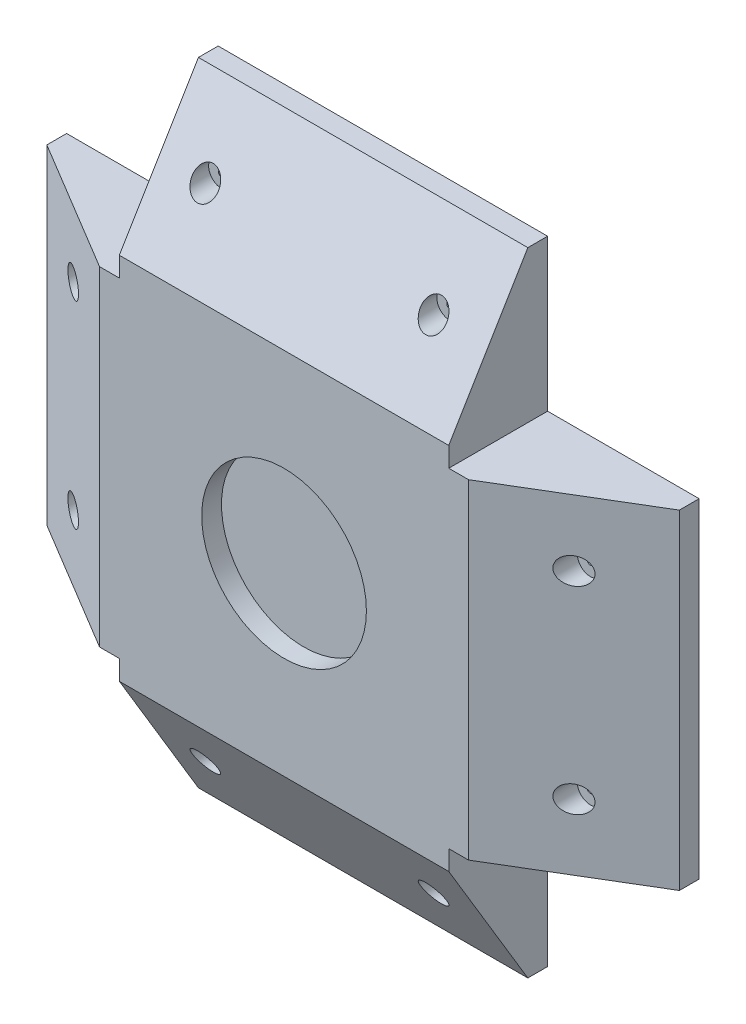
ISO-10303-21;
HEADER;
FILE_DESCRIPTION(('STEP AP214'),'2;1');
FILE_NAME('part.step','',(''),(''),'','','');
FILE_SCHEMA(('AUTOMOTIVE_DESIGN { 1 0 10303 214 1 1 1 1 }'));
ENDSEC;
DATA;
#1=APPLICATION_CONTEXT('core data for automotive mechanical design processes');
#2=APPLICATION_PROTOCOL_DEFINITION('international standard','automotive_design',2000,#1);
#3=PRODUCT_CONTEXT('',#1,'mechanical');
#4=PRODUCT('Part','Part','',(#3));
#5=PRODUCT_RELATED_PRODUCT_CATEGORY('part','',(#4));
#6=PRODUCT_DEFINITION_FORMATION('','',#4);
#7=PRODUCT_DEFINITION_CONTEXT('part definition',#1,'design');
#8=PRODUCT_DEFINITION('design','',#6,#7);
#9=PRODUCT_DEFINITION_SHAPE('','',#8);
#10=(LENGTH_UNIT() NAMED_UNIT(*) SI_UNIT(.MILLI.,.METRE.));
#11=(NAMED_UNIT(*) PLANE_ANGLE_UNIT() SI_UNIT($,.RADIAN.));
#12=(NAMED_UNIT(*) SI_UNIT($,.STERADIAN.) SOLID_ANGLE_UNIT());
#13=UNCERTAINTY_MEASURE_WITH_UNIT(LENGTH_MEASURE(1.E-05),#10,'distance_accuracy_value','');
#14=(GEOMETRIC_REPRESENTATION_CONTEXT(3) GLOBAL_UNCERTAINTY_ASSIGNED_CONTEXT((#13)) GLOBAL_UNIT_ASSIGNED_CONTEXT((#10,
#11,#12)) REPRESENTATION_CONTEXT('',''));
#15=CARTESIAN_POINT('',(0.,0.,0.));
#16=DIRECTION('',(0.,0.,1.));
#17=DIRECTION('',(1.,0.,0.));
#18=AXIS2_PLACEMENT_3D('',#15,#16,#17);
#19=CARTESIAN_POINT('',(-35.8922062958058,-76.,-94.));
#20=DIRECTION('',(0.,0.,1.));
#21=DIRECTION('',(1.,0.,0.));
#22=AXIS2_PLACEMENT_3D('',#19,#20,#21);
#23=CYLINDRICAL_SURFACE('',#22,0.999999999999998);
#24=CARTESIAN_POINT('',(-35.8922062958058,-76.,-24.));
#25=DIRECTION('',(0.,0.,1.));
#26=DIRECTION('',(0.,-1.,0.));
#27=AXIS2_PLACEMENT_3D('',#24,#25,#26);
#28=CIRCLE('',#27,0.999999999999998);
#29=CARTESIAN_POINT('',(-35.8922062958058,-77.,-24.));
#30=VERTEX_POINT('',#29);
#31=EDGE_CURVE('E373',#30,#30,#28,.T.);
#32=ORIENTED_EDGE('',*,*,#31,.F.);
#33=EDGE_LOOP('',(#32));
#34=FACE_BOUND('',#33,.T.);
#35=CARTESIAN_POINT('',(-35.8922062958058,-76.,-11.));
#36=DIRECTION('',(0.,0.,1.));
#37=DIRECTION('',(1.,0.,0.));
#38=AXIS2_PLACEMENT_3D('',#35,#36,#37);
#39=CIRCLE('',#38,0.999999999999998);
#40=CARTESIAN_POINT('',(-34.8922062958058,-76.,-11.));
#41=VERTEX_POINT('',#40);
#42=EDGE_CURVE('E330',#41,#41,#39,.F.);
#43=ORIENTED_EDGE('',*,*,#42,.F.);
#44=EDGE_LOOP('',(#43));
#45=FACE_BOUND('',#44,.T.);
#46=ADVANCED_FACE('F33',(#34,#45),#23,.F.);
#47=CARTESIAN_POINT('',(33.3878088275945,-76.,-94.));
#48=DIRECTION('',(0.,0.,1.));
#49=DIRECTION('',(1.,0.,0.));
#50=AXIS2_PLACEMENT_3D('',#47,#48,#49);
#51=CYLINDRICAL_SURFACE('',#50,0.999999999999998);
#52=CARTESIAN_POINT('',(33.3878088275945,-76.,-24.));
#53=DIRECTION('',(0.,0.,1.));
#54=DIRECTION('',(0.,-1.,0.));
#55=AXIS2_PLACEMENT_3D('',#52,#53,#54);
#56=CIRCLE('',#55,0.999999999999998);
#57=CARTESIAN_POINT('',(33.3878088275945,-77.,-24.));
#58=VERTEX_POINT('',#57);
#59=EDGE_CURVE('E370',#58,#58,#56,.T.);
#60=ORIENTED_EDGE('',*,*,#59,.F.);
#61=EDGE_LOOP('',(#60));
#62=FACE_BOUND('',#61,.T.);
#63=CARTESIAN_POINT('',(33.3878088275945,-76.,-11.));
#64=DIRECTION('',(0.,0.,1.));
#65=DIRECTION('',(1.,0.,0.));
#66=AXIS2_PLACEMENT_3D('',#63,#64,#65);
#67=CIRCLE('',#66,0.999999999999998);
#68=CARTESIAN_POINT('',(34.3878088275945,-76.,-11.));
#69=VERTEX_POINT('',#68);
#70=EDGE_CURVE('E322',#69,#69,#67,.F.);
#71=ORIENTED_EDGE('',*,*,#70,.F.);
#72=EDGE_LOOP('',(#71));
#73=FACE_BOUND('',#72,.T.);
#74=ADVANCED_FACE('F454',(#62,#73),#51,.F.);
#75=CARTESIAN_POINT('',(-50.,50.,6.));
#76=DIRECTION('',(0.,-1.,0.));
#77=DIRECTION('',(0.,0.,-1.));
#78=AXIS2_PLACEMENT_3D('',#75,#76,#77);
#79=PLANE('',#78);
#80=DIRECTION('',(0.,0.,1.));
#81=VECTOR('',#80,1.);
#82=CARTESIAN_POINT('',(50.,50.,6.));
#83=LINE('',#82,#81);
#84=CARTESIAN_POINT('',(50.,50.,-24.));
#85=VERTEX_POINT('',#84);
#86=CARTESIAN_POINT('',(50.,50.,6.));
#87=VERTEX_POINT('',#86);
#88=EDGE_CURVE('E277',#85,#87,#83,.T.);
#89=ORIENTED_EDGE('',*,*,#88,.T.);
#90=DIRECTION('',(-1.,0.,0.));
#91=VECTOR('',#90,1.);
#92=CARTESIAN_POINT('',(-50.,50.,6.));
#93=LINE('',#92,#91);
#94=CARTESIAN_POINT('',(56.,50.,6.));
#95=VERTEX_POINT('',#94);
#96=EDGE_CURVE('E11',#95,#87,#93,.T.);
#97=ORIENTED_EDGE('',*,*,#96,.F.);
#98=DIRECTION('',(-0.857492925712544,0.,0.514495755427527));
#99=VECTOR('',#98,1.);
#100=CARTESIAN_POINT('',(56.,50.,6.));
#101=LINE('',#100,#99);
#102=CARTESIAN_POINT('',(96.,50.,-18.));
#103=VERTEX_POINT('',#102);
#104=EDGE_CURVE('E242',#103,#95,#101,.T.);
#105=ORIENTED_EDGE('',*,*,#104,.F.);
#106=DIRECTION('',(0.,0.,1.));
#107=VECTOR('',#106,1.);
#108=CARTESIAN_POINT('',(96.,50.,-24.));
#109=LINE('',#108,#107);
#110=CARTESIAN_POINT('',(96.,50.,-24.));
#111=VERTEX_POINT('',#110);
#112=EDGE_CURVE('E263',#111,#103,#109,.T.);
#113=ORIENTED_EDGE('',*,*,#112,.F.);
#114=DIRECTION('',(-1.,0.,0.));
#115=VECTOR('',#114,1.);
#116=CARTESIAN_POINT('',(56.,50.,-24.));
#117=LINE('',#116,#115);
#118=EDGE_CURVE('E50',#111,#85,#117,.T.);
#119=ORIENTED_EDGE('',*,*,#118,.T.);
#120=EDGE_LOOP('',(#89,#97,#105,#113,#119));
#121=FACE_BOUND('',#120,.T.);
#122=ADVANCED_FACE('F431',(#121),#79,.F.);
#123=CARTESIAN_POINT('',(-50.,-50.,6.));
#124=DIRECTION('',(0.,1.,0.));
#125=DIRECTION('',(0.,0.,1.));
#126=AXIS2_PLACEMENT_3D('',#123,#124,#125);
#127=PLANE('',#126);
#128=DIRECTION('',(0.,0.,1.));
#129=VECTOR('',#128,1.);
#130=CARTESIAN_POINT('',(-50.,-50.,6.));
#131=LINE('',#130,#129);
#132=CARTESIAN_POINT('',(-50.,-50.,-24.));
#133=VERTEX_POINT('',#132);
#134=CARTESIAN_POINT('',(-50.,-50.,6.));
#135=VERTEX_POINT('',#134);
#136=EDGE_CURVE('E290',#133,#135,#131,.T.);
#137=ORIENTED_EDGE('',*,*,#136,.T.);
#138=DIRECTION('',(1.,0.,0.));
#139=VECTOR('',#138,1.);
#140=CARTESIAN_POINT('',(-50.,-50.,6.));
#141=LINE('',#140,#139);
#142=CARTESIAN_POINT('',(-56.,-50.,6.));
#143=VERTEX_POINT('',#142);
#144=EDGE_CURVE('E302',#143,#135,#141,.T.);
#145=ORIENTED_EDGE('',*,*,#144,.F.);
#146=DIRECTION('',(0.857492925712544,0.,0.514495755427526));
#147=VECTOR('',#146,1.);
#148=CARTESIAN_POINT('',(-96.,-50.,-18.));
#149=LINE('',#148,#147);
#150=CARTESIAN_POINT('',(-96.,-50.,-18.));
#151=VERTEX_POINT('',#150);
#152=EDGE_CURVE('E247',#151,#143,#149,.T.);
#153=ORIENTED_EDGE('',*,*,#152,.F.);
#154=DIRECTION('',(0.,0.,1.));
#155=VECTOR('',#154,1.);
#156=CARTESIAN_POINT('',(-96.,-50.,-24.));
#157=LINE('',#156,#155);
#158=CARTESIAN_POINT('',(-96.,-50.,-24.));
#159=VERTEX_POINT('',#158);
#160=EDGE_CURVE('E257',#159,#151,#157,.T.);
#161=ORIENTED_EDGE('',*,*,#160,.F.);
#162=DIRECTION('',(1.,0.,0.));
#163=VECTOR('',#162,1.);
#164=CARTESIAN_POINT('',(-56.,-50.,-24.));
#165=LINE('',#164,#163);
#166=EDGE_CURVE('E289',#159,#133,#165,.T.);
#167=ORIENTED_EDGE('',*,*,#166,.T.);
#168=EDGE_LOOP('',(#137,#145,#153,#161,#167));
#169=FACE_BOUND('',#168,.T.);
#170=ADVANCED_FACE('F408',(#169),#127,.F.);
#171=CARTESIAN_POINT('',(76.,-30.,36.));
#172=DIRECTION('',(0.,0.,-1.));
#173=DIRECTION('',(-1.,0.,0.));
#174=AXIS2_PLACEMENT_3D('',#171,#172,#173);
#175=CYLINDRICAL_SURFACE('',#174,0.999999999999998);
#176=CARTESIAN_POINT('',(76.,-30.,-24.));
#177=DIRECTION('',(0.,0.,-1.));
#178=DIRECTION('',(-1.,0.,0.));
#179=AXIS2_PLACEMENT_3D('',#176,#177,#178);
#180=CIRCLE('',#179,0.999999999999998);
#181=CARTESIAN_POINT('',(75.,-30.,-24.));
#182=VERTEX_POINT('',#181);
#183=EDGE_CURVE('E235',#182,#182,#180,.T.);
#184=ORIENTED_EDGE('',*,*,#183,.T.);
#185=EDGE_LOOP('',(#184));
#186=FACE_BOUND('',#185,.T.);
#187=CARTESIAN_POINT('',(76.,-30.,-11.));
#188=DIRECTION('',(0.,0.,1.));
#189=DIRECTION('',(1.,0.,0.));
#190=AXIS2_PLACEMENT_3D('',#187,#188,#189);
#191=CIRCLE('',#190,0.999999999999998);
#192=CARTESIAN_POINT('',(77.,-30.,-11.));
#193=VERTEX_POINT('',#192);
#194=EDGE_CURVE('E221',#193,#193,#191,.F.);
#195=ORIENTED_EDGE('',*,*,#194,.F.);
#196=EDGE_LOOP('',(#195));
#197=FACE_BOUND('',#196,.T.);
#198=ADVANCED_FACE('F520',(#186,#197),#175,.F.);
#199=CARTESIAN_POINT('',(76.,30.,36.));
#200=DIRECTION('',(0.,0.,-1.));
#201=DIRECTION('',(-1.,0.,0.));
#202=AXIS2_PLACEMENT_3D('',#199,#200,#201);
#203=CYLINDRICAL_SURFACE('',#202,0.999999999999998);
#204=CARTESIAN_POINT('',(76.,30.,-24.));
#205=DIRECTION('',(0.,0.,-1.));
#206=DIRECTION('',(-1.,0.,0.));
#207=AXIS2_PLACEMENT_3D('',#204,#205,#206);
#208=CIRCLE('',#207,0.999999999999998);
#209=CARTESIAN_POINT('',(75.,30.,-24.));
#210=VERTEX_POINT('',#209);
#211=EDGE_CURVE('E238',#210,#210,#208,.T.);
#212=ORIENTED_EDGE('',*,*,#211,.T.);
#213=EDGE_LOOP('',(#212));
#214=FACE_BOUND('',#213,.T.);
#215=CARTESIAN_POINT('',(76.,30.,-11.));
#216=DIRECTION('',(0.,0.,1.));
#217=DIRECTION('',(1.,0.,0.));
#218=AXIS2_PLACEMENT_3D('',#215,#216,#217);
#219=CIRCLE('',#218,0.999999999999998);
#220=CARTESIAN_POINT('',(77.,30.,-11.));
#221=VERTEX_POINT('',#220);
#222=EDGE_CURVE('E226',#221,#221,#219,.F.);
#223=ORIENTED_EDGE('',*,*,#222,.F.);
#224=EDGE_LOOP('',(#223));
#225=FACE_BOUND('',#224,.T.);
#226=ADVANCED_FACE('F522',(#214,#225),#203,.F.);
#227=CARTESIAN_POINT('',(50.,-50.,6.));
#228=VERTEX_POINT('',#227);
#229=CARTESIAN_POINT('',(56.,-50.,6.));
#230=VERTEX_POINT('',#229);
#231=EDGE_CURVE('E304',#228,#230,#141,.T.);
#232=ORIENTED_EDGE('',*,*,#231,.F.);
#233=DIRECTION('',(0.,0.,-1.));
#234=VECTOR('',#233,1.);
#235=CARTESIAN_POINT('',(50.,-50.,6.));
#236=LINE('',#235,#234);
#237=CARTESIAN_POINT('',(50.,-50.,-24.));
#238=VERTEX_POINT('',#237);
#239=EDGE_CURVE('E273',#228,#238,#236,.T.);
#240=ORIENTED_EDGE('',*,*,#239,.T.);
#241=DIRECTION('',(-1.,0.,0.));
#242=VECTOR('',#241,1.);
#243=CARTESIAN_POINT('',(56.,-50.,-24.));
#244=LINE('',#243,#242);
#245=CARTESIAN_POINT('',(96.,-50.,-24.));
#246=VERTEX_POINT('',#245);
#247=EDGE_CURVE('E58',#246,#238,#244,.T.);
#248=ORIENTED_EDGE('',*,*,#247,.F.);
#249=DIRECTION('',(0.,0.,-1.));
#250=VECTOR('',#249,1.);
#251=CARTESIAN_POINT('',(96.,-50.,-24.));
#252=LINE('',#251,#250);
#253=CARTESIAN_POINT('',(96.,-50.,-18.));
#254=VERTEX_POINT('',#253);
#255=EDGE_CURVE('E269',#254,#246,#252,.T.);
#256=ORIENTED_EDGE('',*,*,#255,.F.);
#257=DIRECTION('',(-0.857492925712544,0.,0.514495755427527));
#258=VECTOR('',#257,1.);
#259=CARTESIAN_POINT('',(56.,-50.,6.));
#260=LINE('',#259,#258);
#261=EDGE_CURVE('E241',#254,#230,#260,.T.);
#262=ORIENTED_EDGE('',*,*,#261,.T.);
#263=EDGE_LOOP('',(#232,#240,#248,#256,#262));
#264=FACE_BOUND('',#263,.T.);
#265=ADVANCED_FACE('F35',(#264),#127,.F.);
#266=CARTESIAN_POINT('',(-50.,50.,6.));
#267=VERTEX_POINT('',#266);
#268=CARTESIAN_POINT('',(-56.,50.,6.));
#269=VERTEX_POINT('',#268);
#270=EDGE_CURVE('E42',#267,#269,#93,.T.);
#271=ORIENTED_EDGE('',*,*,#270,.F.);
#272=DIRECTION('',(0.,0.,-1.));
#273=VECTOR('',#272,1.);
#274=CARTESIAN_POINT('',(-50.,50.,6.));
#275=LINE('',#274,#273);
#276=CARTESIAN_POINT('',(-50.,50.,-24.));
#277=VERTEX_POINT('',#276);
#278=EDGE_CURVE('E296',#267,#277,#275,.T.);
#279=ORIENTED_EDGE('',*,*,#278,.T.);
#280=DIRECTION('',(1.,0.,0.));
#281=VECTOR('',#280,1.);
#282=CARTESIAN_POINT('',(-56.,50.,-24.));
#283=LINE('',#282,#281);
#284=CARTESIAN_POINT('',(-96.,50.,-24.));
#285=VERTEX_POINT('',#284);
#286=EDGE_CURVE('E300',#285,#277,#283,.T.);
#287=ORIENTED_EDGE('',*,*,#286,.F.);
#288=DIRECTION('',(0.,0.,-1.));
#289=VECTOR('',#288,1.);
#290=CARTESIAN_POINT('',(-96.,50.,-24.));
#291=LINE('',#290,#289);
#292=CARTESIAN_POINT('',(-96.,50.,-18.));
#293=VERTEX_POINT('',#292);
#294=EDGE_CURVE('E249',#293,#285,#291,.T.);
#295=ORIENTED_EDGE('',*,*,#294,.F.);
#296=DIRECTION('',(0.857492925712544,0.,0.514495755427526));
#297=VECTOR('',#296,1.);
#298=CARTESIAN_POINT('',(-96.,50.,-18.));
#299=LINE('',#298,#297);
#300=EDGE_CURVE('E244',#293,#269,#299,.T.);
#301=ORIENTED_EDGE('',*,*,#300,.T.);
#302=EDGE_LOOP('',(#271,#279,#287,#295,#301));
#303=FACE_BOUND('',#302,.T.);
#304=ADVANCED_FACE('F396',(#303),#79,.F.);
#305=CARTESIAN_POINT('',(0.,0.,6.));
#306=DIRECTION('',(0.,0.,-1.));
#307=DIRECTION('',(-1.,0.,0.));
#308=AXIS2_PLACEMENT_3D('',#305,#306,#307);
#309=PLANE('',#308);
#310=CARTESIAN_POINT('',(0.,0.,6.));
#311=DIRECTION('',(0.,0.,1.));
#312=DIRECTION('',(1.,0.,0.));
#313=AXIS2_PLACEMENT_3D('',#310,#311,#312);
#314=CIRCLE('',#313,25.);
#315=CARTESIAN_POINT('',(25.,0.,6.));
#316=VERTEX_POINT('',#315);
#317=EDGE_CURVE('E355',#316,#316,#314,.T.);
#318=ORIENTED_EDGE('',*,*,#317,.F.);
#319=EDGE_LOOP('',(#318));
#320=FACE_BOUND('',#319,.T.);
#321=ORIENTED_EDGE('',*,*,#96,.T.);
#322=DIRECTION('',(0.,1.,0.));
#323=VECTOR('',#322,1.);
#324=CARTESIAN_POINT('',(50.,47.,6.));
#325=LINE('',#324,#323);
#326=CARTESIAN_POINT('',(50.,56.,5.99999999999998));
#327=VERTEX_POINT('',#326);
#328=EDGE_CURVE('E169',#87,#327,#325,.T.);
#329=ORIENTED_EDGE('',*,*,#328,.T.);
#330=DIRECTION('',(1.,0.,0.));
#331=VECTOR('',#330,1.);
#332=CARTESIAN_POINT('',(50.,56.,6.));
#333=LINE('',#332,#331);
#334=CARTESIAN_POINT('',(-50.,56.,6.));
#335=VERTEX_POINT('',#334);
#336=EDGE_CURVE('E151',#335,#327,#333,.T.);
#337=ORIENTED_EDGE('',*,*,#336,.F.);
#338=DIRECTION('',(0.,1.,0.));
#339=VECTOR('',#338,1.);
#340=CARTESIAN_POINT('',(-50.,47.,6.));
#341=LINE('',#340,#339);
#342=EDGE_CURVE('E178',#267,#335,#341,.T.);
#343=ORIENTED_EDGE('',*,*,#342,.F.);
#344=ORIENTED_EDGE('',*,*,#270,.T.);
#345=DIRECTION('',(0.,1.,0.));
#346=VECTOR('',#345,1.);
#347=CARTESIAN_POINT('',(-56.,50.,6.));
#348=LINE('',#347,#346);
#349=EDGE_CURVE('E286',#143,#269,#348,.T.);
#350=ORIENTED_EDGE('',*,*,#349,.F.);
#351=ORIENTED_EDGE('',*,*,#144,.T.);
#352=DIRECTION('',(0.,-1.,0.));
#353=VECTOR('',#352,1.);
#354=CARTESIAN_POINT('',(-50.,-47.,6.));
#355=LINE('',#354,#353);
#356=CARTESIAN_POINT('',(-50.,-56.,6.));
#357=VERTEX_POINT('',#356);
#358=EDGE_CURVE('E200',#135,#357,#355,.T.);
#359=ORIENTED_EDGE('',*,*,#358,.T.);
#360=DIRECTION('',(-1.,0.,0.));
#361=VECTOR('',#360,1.);
#362=CARTESIAN_POINT('',(-50.,-56.,6.));
#363=LINE('',#362,#361);
#364=CARTESIAN_POINT('',(50.,-56.,6.00000000000002));
#365=VERTEX_POINT('',#364);
#366=EDGE_CURVE('E197',#365,#357,#363,.T.);
#367=ORIENTED_EDGE('',*,*,#366,.F.);
#368=DIRECTION('',(0.,-1.,0.));
#369=VECTOR('',#368,1.);
#370=CARTESIAN_POINT('',(50.,-47.,6.));
#371=LINE('',#370,#369);
#372=EDGE_CURVE('E204',#228,#365,#371,.T.);
#373=ORIENTED_EDGE('',*,*,#372,.F.);
#374=ORIENTED_EDGE('',*,*,#231,.T.);
#375=DIRECTION('',(0.,-1.,0.));
#376=VECTOR('',#375,1.);
#377=CARTESIAN_POINT('',(56.,-50.,6.));
#378=LINE('',#377,#376);
#379=EDGE_CURVE('E274',#95,#230,#378,.T.);
#380=ORIENTED_EDGE('',*,*,#379,.F.);
#381=EDGE_LOOP('',(#321,#329,#337,#343,#344,#350,#351,#359,#367,#373,#374,#380));
#382=FACE_BOUND('',#381,.T.);
#383=ADVANCED_FACE('F174',(#320,#382),#309,.F.);
#384=CARTESIAN_POINT('',(-56.,50.,-24.));
#385=DIRECTION('',(0.,0.,1.));
#386=DIRECTION('',(0.,-1.,0.));
#387=AXIS2_PLACEMENT_3D('',#384,#385,#386);
#388=PLANE('',#387);
#389=CARTESIAN_POINT('',(-35.8922062958058,76.,-24.));
#390=DIRECTION('',(0.,0.,1.));
#391=DIRECTION('',(0.,-1.,0.));
#392=AXIS2_PLACEMENT_3D('',#389,#390,#391);
#393=CIRCLE('',#392,0.999999999999998);
#394=CARTESIAN_POINT('',(-35.8922062958058,75.,-24.));
#395=VERTEX_POINT('',#394);
#396=EDGE_CURVE('E329',#395,#395,#393,.T.);
#397=ORIENTED_EDGE('',*,*,#396,.T.);
#398=EDGE_LOOP('',(#397));
#399=FACE_BOUND('',#398,.T.);
#400=CARTESIAN_POINT('',(33.3878088275945,76.,-24.));
#401=DIRECTION('',(0.,0.,1.));
#402=DIRECTION('',(0.,-1.,0.));
#403=AXIS2_PLACEMENT_3D('',#400,#401,#402);
#404=CIRCLE('',#403,0.999999999999998);
#405=CARTESIAN_POINT('',(33.3878088275945,75.,-24.));
#406=VERTEX_POINT('',#405);
#407=EDGE_CURVE('E367',#406,#406,#404,.T.);
#408=ORIENTED_EDGE('',*,*,#407,.T.);
#409=EDGE_LOOP('',(#408));
#410=FACE_BOUND('',#409,.T.);
#411=ORIENTED_EDGE('',*,*,#59,.T.);
#412=EDGE_LOOP('',(#411));
#413=FACE_BOUND('',#412,.T.);
#414=ORIENTED_EDGE('',*,*,#31,.T.);
#415=EDGE_LOOP('',(#414));
#416=FACE_BOUND('',#415,.T.);
#417=CARTESIAN_POINT('',(-76.,30.,-24.));
#418=DIRECTION('',(0.,0.,-1.));
#419=DIRECTION('',(1.,0.,0.));
#420=AXIS2_PLACEMENT_3D('',#417,#418,#419);
#421=CIRCLE('',#420,0.999999999999998);
#422=CARTESIAN_POINT('',(-75.,30.,-24.));
#423=VERTEX_POINT('',#422);
#424=EDGE_CURVE('E228',#423,#423,#421,.T.);
#425=ORIENTED_EDGE('',*,*,#424,.F.);
#426=EDGE_LOOP('',(#425));
#427=FACE_BOUND('',#426,.T.);
#428=CARTESIAN_POINT('',(-76.,-30.,-24.));
#429=DIRECTION('',(0.,0.,-1.));
#430=DIRECTION('',(1.,0.,0.));
#431=AXIS2_PLACEMENT_3D('',#428,#429,#430);
#432=CIRCLE('',#431,0.999999999999998);
#433=CARTESIAN_POINT('',(-75.,-30.,-24.));
#434=VERTEX_POINT('',#433);
#435=EDGE_CURVE('E231',#434,#434,#432,.T.);
#436=ORIENTED_EDGE('',*,*,#435,.F.);
#437=EDGE_LOOP('',(#436));
#438=FACE_BOUND('',#437,.T.);
#439=ORIENTED_EDGE('',*,*,#286,.T.);
#440=DIRECTION('',(0.,1.,0.));
#441=VECTOR('',#440,1.);
#442=CARTESIAN_POINT('',(-50.,47.,-24.));
#443=LINE('',#442,#441);
#444=CARTESIAN_POINT('',(-50.,96.,-24.));
#445=VERTEX_POINT('',#444);
#446=EDGE_CURVE('E183',#277,#445,#443,.T.);
#447=ORIENTED_EDGE('',*,*,#446,.T.);
#448=DIRECTION('',(-1.,0.,0.));
#449=VECTOR('',#448,1.);
#450=CARTESIAN_POINT('',(-50.,96.,-24.));
#451=LINE('',#450,#449);
#452=CARTESIAN_POINT('',(50.,96.,-24.));
#453=VERTEX_POINT('',#452);
#454=EDGE_CURVE('E163',#453,#445,#451,.T.);
#455=ORIENTED_EDGE('',*,*,#454,.F.);
#456=DIRECTION('',(0.,1.,0.));
#457=VECTOR('',#456,1.);
#458=CARTESIAN_POINT('',(50.,47.,-24.));
#459=LINE('',#458,#457);
#460=EDGE_CURVE('E162',#85,#453,#459,.T.);
#461=ORIENTED_EDGE('',*,*,#460,.F.);
#462=ORIENTED_EDGE('',*,*,#118,.F.);
#463=DIRECTION('',(0.,1.,0.));
#464=VECTOR('',#463,1.);
#465=CARTESIAN_POINT('',(96.,50.,-24.));
#466=LINE('',#465,#464);
#467=EDGE_CURVE('E271',#246,#111,#466,.T.);
#468=ORIENTED_EDGE('',*,*,#467,.F.);
#469=ORIENTED_EDGE('',*,*,#247,.T.);
#470=DIRECTION('',(0.,-1.,0.));
#471=VECTOR('',#470,1.);
#472=CARTESIAN_POINT('',(50.,-47.,-24.));
#473=LINE('',#472,#471);
#474=CARTESIAN_POINT('',(50.,-96.,-24.));
#475=VERTEX_POINT('',#474);
#476=EDGE_CURVE('E207',#238,#475,#473,.T.);
#477=ORIENTED_EDGE('',*,*,#476,.T.);
#478=DIRECTION('',(1.,0.,0.));
#479=VECTOR('',#478,1.);
#480=CARTESIAN_POINT('',(-50.,-96.,-24.));
#481=LINE('',#480,#479);
#482=CARTESIAN_POINT('',(-50.,-96.,-24.));
#483=VERTEX_POINT('',#482);
#484=EDGE_CURVE('E181',#483,#475,#481,.T.);
#485=ORIENTED_EDGE('',*,*,#484,.F.);
#486=DIRECTION('',(0.,-1.,0.));
#487=VECTOR('',#486,1.);
#488=CARTESIAN_POINT('',(-50.,-47.,-24.));
#489=LINE('',#488,#487);
#490=EDGE_CURVE('E199',#133,#483,#489,.T.);
#491=ORIENTED_EDGE('',*,*,#490,.F.);
#492=ORIENTED_EDGE('',*,*,#166,.F.);
#493=DIRECTION('',(0.,-1.,0.));
#494=VECTOR('',#493,1.);
#495=CARTESIAN_POINT('',(-96.,50.,-24.));
#496=LINE('',#495,#494);
#497=EDGE_CURVE('E254',#285,#159,#496,.T.);
#498=ORIENTED_EDGE('',*,*,#497,.F.);
#499=EDGE_LOOP('',(#439,#447,#455,#461,#462,#468,#469,#477,#485,#491,#492,#498));
#500=FACE_BOUND('',#499,.T.);
#501=ORIENTED_EDGE('',*,*,#183,.F.);
#502=EDGE_LOOP('',(#501));
#503=FACE_BOUND('',#502,.T.);
#504=ORIENTED_EDGE('',*,*,#211,.F.);
#505=EDGE_LOOP('',(#504));
#506=FACE_BOUND('',#505,.T.);
#507=ADVANCED_FACE('F427',(#399,#410,#413,#416,#427,#438,#500,#503,#506),#388,.F.);
#508=CARTESIAN_POINT('',(96.,0.,0.));
#509=DIRECTION('',(1.,0.,0.));
#510=DIRECTION('',(0.,0.,-1.));
#511=AXIS2_PLACEMENT_3D('',#508,#509,#510);
#512=PLANE('',#511);
#513=ORIENTED_EDGE('',*,*,#112,.T.);
#514=DIRECTION('',(0.,-1.,0.));
#515=VECTOR('',#514,1.);
#516=CARTESIAN_POINT('',(96.,50.,-18.));
#517=LINE('',#516,#515);
#518=EDGE_CURVE('E266',#103,#254,#517,.T.);
#519=ORIENTED_EDGE('',*,*,#518,.T.);
#520=ORIENTED_EDGE('',*,*,#255,.T.);
#521=ORIENTED_EDGE('',*,*,#467,.T.);
#522=EDGE_LOOP('',(#513,#519,#520,#521));
#523=FACE_BOUND('',#522,.T.);
#524=ADVANCED_FACE('F434',(#523),#512,.T.);
#525=CARTESIAN_POINT('',(-96.,0.,0.));
#526=DIRECTION('',(1.,0.,0.));
#527=DIRECTION('',(0.,0.,-1.));
#528=AXIS2_PLACEMENT_3D('',#525,#526,#527);
#529=PLANE('',#528);
#530=ORIENTED_EDGE('',*,*,#294,.T.);
#531=ORIENTED_EDGE('',*,*,#497,.T.);
#532=ORIENTED_EDGE('',*,*,#160,.T.);
#533=DIRECTION('',(0.,1.,0.));
#534=VECTOR('',#533,1.);
#535=CARTESIAN_POINT('',(-96.,50.,-18.));
#536=LINE('',#535,#534);
#537=EDGE_CURVE('E260',#151,#293,#536,.T.);
#538=ORIENTED_EDGE('',*,*,#537,.T.);
#539=EDGE_LOOP('',(#530,#531,#532,#538));
#540=FACE_BOUND('',#539,.T.);
#541=ADVANCED_FACE('F403',(#540),#529,.F.);
#542=CARTESIAN_POINT('',(-96.,-50.,-18.));
#543=DIRECTION('',(-0.514495755427526,0.,0.857492925712544));
#544=DIRECTION('',(0.857492925712544,0.,0.514495755427526));
#545=AXIS2_PLACEMENT_3D('',#542,#543,#544);
#546=PLANE('',#545);
#547=CARTESIAN_POINT('',(-76.,30.,-6.));
#548=DIRECTION('',(-0.514495755427526,0.,0.857492925712544));
#549=DIRECTION('',(0.857492925712544,0.,0.514495755427526));
#550=AXIS2_PLACEMENT_3D('',#547,#548,#549);
#551=ELLIPSE('',#550,4.66476151587625,4.00000000000001);
#552=CARTESIAN_POINT('',(-72.,30.,-3.6));
#553=VERTEX_POINT('',#552);
#554=EDGE_CURVE('E217',#553,#553,#551,.T.);
#555=ORIENTED_EDGE('',*,*,#554,.F.);
#556=EDGE_LOOP('',(#555));
#557=FACE_BOUND('',#556,.T.);
#558=CARTESIAN_POINT('',(-76.,-30.,-5.99999999999999));
#559=DIRECTION('',(-0.514495755427526,0.,0.857492925712544));
#560=DIRECTION('',(0.857492925712544,0.,0.514495755427526));
#561=AXIS2_PLACEMENT_3D('',#558,#559,#560);
#562=ELLIPSE('',#561,4.66476151587625,4.00000000000001);
#563=CARTESIAN_POINT('',(-72.,-30.,-3.59999999999999));
#564=VERTEX_POINT('',#563);
#565=EDGE_CURVE('E222',#564,#564,#562,.T.);
#566=ORIENTED_EDGE('',*,*,#565,.F.);
#567=EDGE_LOOP('',(#566));
#568=FACE_BOUND('',#567,.T.);
#569=ORIENTED_EDGE('',*,*,#300,.F.);
#570=ORIENTED_EDGE('',*,*,#537,.F.);
#571=ORIENTED_EDGE('',*,*,#152,.T.);
#572=ORIENTED_EDGE('',*,*,#349,.T.);
#573=EDGE_LOOP('',(#569,#570,#571,#572));
#574=FACE_BOUND('',#573,.T.);
#575=ADVANCED_FACE('F400',(#557,#568,#574),#546,.T.);
#576=CARTESIAN_POINT('',(56.,50.,6.));
#577=DIRECTION('',(0.514495755427527,0.,0.857492925712544));
#578=DIRECTION('',(0.857492925712544,0.,-0.514495755427527));
#579=AXIS2_PLACEMENT_3D('',#576,#577,#578);
#580=PLANE('',#579);
#581=CARTESIAN_POINT('',(76.,-30.,-5.99999999999999));
#582=DIRECTION('',(0.514495755427527,0.,0.857492925712544));
#583=DIRECTION('',(-0.857492925712544,0.,0.514495755427527));
#584=AXIS2_PLACEMENT_3D('',#581,#582,#583);
#585=ELLIPSE('',#584,4.66476151587625,4.00000000000001);
#586=CARTESIAN_POINT('',(72.,-30.,-3.59999999999999));
#587=VERTEX_POINT('',#586);
#588=EDGE_CURVE('E227',#587,#587,#585,.T.);
#589=ORIENTED_EDGE('',*,*,#588,.F.);
#590=EDGE_LOOP('',(#589));
#591=FACE_BOUND('',#590,.T.);
#592=CARTESIAN_POINT('',(76.,30.,-6.));
#593=DIRECTION('',(0.514495755427527,0.,0.857492925712544));
#594=DIRECTION('',(-0.857492925712544,0.,0.514495755427527));
#595=AXIS2_PLACEMENT_3D('',#592,#593,#594);
#596=ELLIPSE('',#595,4.66476151587625,4.00000000000001);
#597=CARTESIAN_POINT('',(72.,30.,-3.6));
#598=VERTEX_POINT('',#597);
#599=EDGE_CURVE('E232',#598,#598,#596,.T.);
#600=ORIENTED_EDGE('',*,*,#599,.F.);
#601=EDGE_LOOP('',(#600));
#602=FACE_BOUND('',#601,.T.);
#603=ORIENTED_EDGE('',*,*,#261,.F.);
#604=ORIENTED_EDGE('',*,*,#518,.F.);
#605=ORIENTED_EDGE('',*,*,#104,.T.);
#606=ORIENTED_EDGE('',*,*,#379,.T.);
#607=EDGE_LOOP('',(#603,#604,#605,#606));
#608=FACE_BOUND('',#607,.T.);
#609=ADVANCED_FACE('F436',(#591,#602,#608),#580,.T.);
#610=CARTESIAN_POINT('',(-76.,-30.,36.));
#611=DIRECTION('',(0.,0.,-1.));
#612=DIRECTION('',(-1.,0.,0.));
#613=AXIS2_PLACEMENT_3D('',#610,#611,#612);
#614=CYLINDRICAL_SURFACE('',#613,0.999999999999998);
#615=CARTESIAN_POINT('',(-76.,-30.,-11.));
#616=DIRECTION('',(0.,0.,-1.));
#617=DIRECTION('',(-1.,0.,0.));
#618=AXIS2_PLACEMENT_3D('',#615,#616,#617);
#619=CIRCLE('',#618,0.999999999999998);
#620=CARTESIAN_POINT('',(-77.,-30.,-11.));
#621=VERTEX_POINT('',#620);
#622=EDGE_CURVE('E216',#621,#621,#619,.F.);
#623=ORIENTED_EDGE('',*,*,#622,.T.);
#624=EDGE_LOOP('',(#623));
#625=FACE_BOUND('',#624,.T.);
#626=ORIENTED_EDGE('',*,*,#435,.T.);
#627=EDGE_LOOP('',(#626));
#628=FACE_BOUND('',#627,.T.);
#629=ADVANCED_FACE('F438',(#625,#628),#614,.F.);
#630=CARTESIAN_POINT('',(-76.,30.,36.));
#631=DIRECTION('',(0.,0.,-1.));
#632=DIRECTION('',(-1.,0.,0.));
#633=AXIS2_PLACEMENT_3D('',#630,#631,#632);
#634=CYLINDRICAL_SURFACE('',#633,0.999999999999998);
#635=CARTESIAN_POINT('',(-76.,30.,-11.));
#636=DIRECTION('',(0.,0.,-1.));
#637=DIRECTION('',(-1.,0.,0.));
#638=AXIS2_PLACEMENT_3D('',#635,#636,#637);
#639=CIRCLE('',#638,0.999999999999998);
#640=CARTESIAN_POINT('',(-77.,30.,-11.));
#641=VERTEX_POINT('',#640);
#642=EDGE_CURVE('E212',#641,#641,#639,.F.);
#643=ORIENTED_EDGE('',*,*,#642,.T.);
#644=EDGE_LOOP('',(#643));
#645=FACE_BOUND('',#644,.T.);
#646=ORIENTED_EDGE('',*,*,#424,.T.);
#647=EDGE_LOOP('',(#646));
#648=FACE_BOUND('',#647,.T.);
#649=ADVANCED_FACE('F445',(#645,#648),#634,.F.);
#650=CARTESIAN_POINT('',(76.,30.,-11.));
#651=DIRECTION('',(0.,0.,1.));
#652=DIRECTION('',(1.,0.,0.));
#653=AXIS2_PLACEMENT_3D('',#650,#651,#652);
#654=PLANE('',#653);
#655=CARTESIAN_POINT('',(76.,30.,-11.));
#656=DIRECTION('',(0.,0.,1.));
#657=DIRECTION('',(1.,0.,0.));
#658=AXIS2_PLACEMENT_3D('',#655,#656,#657);
#659=CIRCLE('',#658,4.00000000000001);
#660=CARTESIAN_POINT('',(80.,30.,-11.));
#661=VERTEX_POINT('',#660);
#662=EDGE_CURVE('E223',#661,#661,#659,.T.);
#663=ORIENTED_EDGE('',*,*,#662,.T.);
#664=EDGE_LOOP('',(#663));
#665=FACE_BOUND('',#664,.T.);
#666=ORIENTED_EDGE('',*,*,#222,.T.);
#667=EDGE_LOOP('',(#666));
#668=FACE_BOUND('',#667,.T.);
#669=ADVANCED_FACE('F510',(#665,#668),#654,.T.);
#670=CARTESIAN_POINT('',(76.,30.,-11.));
#671=DIRECTION('',(0.,0.,1.));
#672=DIRECTION('',(1.,0.,0.));
#673=AXIS2_PLACEMENT_3D('',#670,#671,#672);
#674=CYLINDRICAL_SURFACE('',#673,4.00000000000001);
#675=ORIENTED_EDGE('',*,*,#599,.T.);
#676=EDGE_LOOP('',(#675));
#677=FACE_BOUND('',#676,.T.);
#678=ORIENTED_EDGE('',*,*,#662,.F.);
#679=EDGE_LOOP('',(#678));
#680=FACE_BOUND('',#679,.T.);
#681=ADVANCED_FACE('F505',(#677,#680),#674,.F.);
#682=CARTESIAN_POINT('',(76.,-30.,-11.));
#683=DIRECTION('',(0.,0.,1.));
#684=DIRECTION('',(1.,0.,0.));
#685=AXIS2_PLACEMENT_3D('',#682,#683,#684);
#686=PLANE('',#685);
#687=CARTESIAN_POINT('',(76.,-30.,-11.));
#688=DIRECTION('',(0.,0.,1.));
#689=DIRECTION('',(1.,0.,0.));
#690=AXIS2_PLACEMENT_3D('',#687,#688,#689);
#691=CIRCLE('',#690,4.00000000000001);
#692=CARTESIAN_POINT('',(80.,-30.,-11.));
#693=VERTEX_POINT('',#692);
#694=EDGE_CURVE('E218',#693,#693,#691,.T.);
#695=ORIENTED_EDGE('',*,*,#694,.T.);
#696=EDGE_LOOP('',(#695));
#697=FACE_BOUND('',#696,.T.);
#698=ORIENTED_EDGE('',*,*,#194,.T.);
#699=EDGE_LOOP('',(#698));
#700=FACE_BOUND('',#699,.T.);
#701=ADVANCED_FACE('F502',(#697,#700),#686,.T.);
#702=CARTESIAN_POINT('',(76.,-30.,-11.));
#703=DIRECTION('',(0.,0.,1.));
#704=DIRECTION('',(1.,0.,0.));
#705=AXIS2_PLACEMENT_3D('',#702,#703,#704);
#706=CYLINDRICAL_SURFACE('',#705,4.00000000000001);
#707=ORIENTED_EDGE('',*,*,#588,.T.);
#708=EDGE_LOOP('',(#707));
#709=FACE_BOUND('',#708,.T.);
#710=ORIENTED_EDGE('',*,*,#694,.F.);
#711=EDGE_LOOP('',(#710));
#712=FACE_BOUND('',#711,.T.);
#713=ADVANCED_FACE('F497',(#709,#712),#706,.F.);
#714=CARTESIAN_POINT('',(-76.,-30.,-11.));
#715=DIRECTION('',(0.,0.,-1.));
#716=DIRECTION('',(-1.,0.,0.));
#717=AXIS2_PLACEMENT_3D('',#714,#715,#716);
#718=PLANE('',#717);
#719=CARTESIAN_POINT('',(-76.,-30.,-11.));
#720=DIRECTION('',(0.,0.,1.));
#721=DIRECTION('',(-1.,0.,0.));
#722=AXIS2_PLACEMENT_3D('',#719,#720,#721);
#723=CIRCLE('',#722,4.00000000000001);
#724=CARTESIAN_POINT('',(-80.,-30.,-11.));
#725=VERTEX_POINT('',#724);
#726=EDGE_CURVE('E213',#725,#725,#723,.T.);
#727=ORIENTED_EDGE('',*,*,#726,.T.);
#728=EDGE_LOOP('',(#727));
#729=FACE_BOUND('',#728,.T.);
#730=ORIENTED_EDGE('',*,*,#622,.F.);
#731=EDGE_LOOP('',(#730));
#732=FACE_BOUND('',#731,.T.);
#733=ADVANCED_FACE('F494',(#729,#732),#718,.F.);
#734=CARTESIAN_POINT('',(-76.,-30.,-11.));
#735=DIRECTION('',(0.,0.,1.));
#736=DIRECTION('',(1.,0.,0.));
#737=AXIS2_PLACEMENT_3D('',#734,#735,#736);
#738=CYLINDRICAL_SURFACE('',#737,4.00000000000001);
#739=ORIENTED_EDGE('',*,*,#565,.T.);
#740=EDGE_LOOP('',(#739));
#741=FACE_BOUND('',#740,.T.);
#742=ORIENTED_EDGE('',*,*,#726,.F.);
#743=EDGE_LOOP('',(#742));
#744=FACE_BOUND('',#743,.T.);
#745=ADVANCED_FACE('F489',(#741,#744),#738,.F.);
#746=CARTESIAN_POINT('',(-76.,30.,-11.));
#747=DIRECTION('',(0.,0.,-1.));
#748=DIRECTION('',(-1.,0.,0.));
#749=AXIS2_PLACEMENT_3D('',#746,#747,#748);
#750=PLANE('',#749);
#751=CARTESIAN_POINT('',(-76.,30.,-11.));
#752=DIRECTION('',(0.,0.,1.));
#753=DIRECTION('',(-1.,0.,0.));
#754=AXIS2_PLACEMENT_3D('',#751,#752,#753);
#755=CIRCLE('',#754,4.00000000000001);
#756=CARTESIAN_POINT('',(-80.,30.,-11.));
#757=VERTEX_POINT('',#756);
#758=EDGE_CURVE('E203',#757,#757,#755,.T.);
#759=ORIENTED_EDGE('',*,*,#758,.T.);
#760=EDGE_LOOP('',(#759));
#761=FACE_BOUND('',#760,.T.);
#762=ORIENTED_EDGE('',*,*,#642,.F.);
#763=EDGE_LOOP('',(#762));
#764=FACE_BOUND('',#763,.T.);
#765=ADVANCED_FACE('F486',(#761,#764),#750,.F.);
#766=CARTESIAN_POINT('',(-76.,30.,-11.));
#767=DIRECTION('',(0.,0.,1.));
#768=DIRECTION('',(1.,0.,0.));
#769=AXIS2_PLACEMENT_3D('',#766,#767,#768);
#770=CYLINDRICAL_SURFACE('',#769,4.00000000000001);
#771=ORIENTED_EDGE('',*,*,#554,.T.);
#772=EDGE_LOOP('',(#771));
#773=FACE_BOUND('',#772,.T.);
#774=ORIENTED_EDGE('',*,*,#758,.F.);
#775=EDGE_LOOP('',(#774));
#776=FACE_BOUND('',#775,.T.);
#777=ADVANCED_FACE('F485',(#773,#776),#770,.F.);
#778=CARTESIAN_POINT('',(-50.,-47.,-24.));
#779=DIRECTION('',(-1.,0.,0.));
#780=DIRECTION('',(0.,0.,1.));
#781=AXIS2_PLACEMENT_3D('',#778,#779,#780);
#782=PLANE('',#781);
#783=ORIENTED_EDGE('',*,*,#136,.F.);
#784=ORIENTED_EDGE('',*,*,#490,.T.);
#785=DIRECTION('',(0.,0.,-1.));
#786=VECTOR('',#785,1.);
#787=CARTESIAN_POINT('',(-50.,-96.,-24.));
#788=LINE('',#787,#786);
#789=CARTESIAN_POINT('',(-50.,-96.,-18.));
#790=VERTEX_POINT('',#789);
#791=EDGE_CURVE('E177',#790,#483,#788,.T.);
#792=ORIENTED_EDGE('',*,*,#791,.F.);
#793=DIRECTION('',(0.,0.857492925712544,0.514495755427526));
#794=VECTOR('',#793,1.);
#795=CARTESIAN_POINT('',(-50.,-56.,6.));
#796=LINE('',#795,#794);
#797=EDGE_CURVE('E172',#790,#357,#796,.T.);
#798=ORIENTED_EDGE('',*,*,#797,.T.);
#799=ORIENTED_EDGE('',*,*,#358,.F.);
#800=EDGE_LOOP('',(#783,#784,#792,#798,#799));
#801=FACE_BOUND('',#800,.T.);
#802=ADVANCED_FACE('F414',(#801),#782,.T.);
#803=CARTESIAN_POINT('',(50.,-47.,-24.));
#804=DIRECTION('',(1.,0.,0.));
#805=DIRECTION('',(0.,0.,-1.));
#806=AXIS2_PLACEMENT_3D('',#803,#804,#805);
#807=PLANE('',#806);
#808=ORIENTED_EDGE('',*,*,#372,.T.);
#809=DIRECTION('',(0.,0.857492925712544,0.514495755427526));
#810=VECTOR('',#809,1.);
#811=CARTESIAN_POINT('',(50.,-56.,6.00000000000002));
#812=LINE('',#811,#810);
#813=CARTESIAN_POINT('',(50.,-96.,-18.));
#814=VERTEX_POINT('',#813);
#815=EDGE_CURVE('E377',#814,#365,#812,.T.);
#816=ORIENTED_EDGE('',*,*,#815,.F.);
#817=DIRECTION('',(0.,0.,1.));
#818=VECTOR('',#817,1.);
#819=CARTESIAN_POINT('',(50.,-96.,-24.));
#820=LINE('',#819,#818);
#821=EDGE_CURVE('E191',#475,#814,#820,.T.);
#822=ORIENTED_EDGE('',*,*,#821,.F.);
#823=ORIENTED_EDGE('',*,*,#476,.F.);
#824=ORIENTED_EDGE('',*,*,#239,.F.);
#825=EDGE_LOOP('',(#808,#816,#822,#823,#824));
#826=FACE_BOUND('',#825,.T.);
#827=ADVANCED_FACE('F425',(#826),#807,.T.);
#828=CARTESIAN_POINT('',(0.,-96.,0.));
#829=DIRECTION('',(0.,1.,0.));
#830=DIRECTION('',(0.,0.,1.));
#831=AXIS2_PLACEMENT_3D('',#828,#829,#830);
#832=PLANE('',#831);
#833=ORIENTED_EDGE('',*,*,#791,.T.);
#834=ORIENTED_EDGE('',*,*,#484,.T.);
#835=ORIENTED_EDGE('',*,*,#821,.T.);
#836=DIRECTION('',(-1.,0.,0.));
#837=VECTOR('',#836,1.);
#838=CARTESIAN_POINT('',(-50.,-96.,-18.));
#839=LINE('',#838,#837);
#840=EDGE_CURVE('E194',#814,#790,#839,.T.);
#841=ORIENTED_EDGE('',*,*,#840,.T.);
#842=EDGE_LOOP('',(#833,#834,#835,#841));
#843=FACE_BOUND('',#842,.T.);
#844=ADVANCED_FACE('F421',(#843),#832,.F.);
#845=CARTESIAN_POINT('',(50.,47.,-24.));
#846=DIRECTION('',(1.,0.,0.));
#847=DIRECTION('',(0.,0.,-1.));
#848=AXIS2_PLACEMENT_3D('',#845,#846,#847);
#849=PLANE('',#848);
#850=ORIENTED_EDGE('',*,*,#88,.F.);
#851=ORIENTED_EDGE('',*,*,#460,.T.);
#852=DIRECTION('',(0.,0.,-1.));
#853=VECTOR('',#852,1.);
#854=CARTESIAN_POINT('',(50.,96.,-24.));
#855=LINE('',#854,#853);
#856=CARTESIAN_POINT('',(50.,96.,-18.));
#857=VERTEX_POINT('',#856);
#858=EDGE_CURVE('E171',#857,#453,#855,.T.);
#859=ORIENTED_EDGE('',*,*,#858,.F.);
#860=DIRECTION('',(0.,0.857492925712544,-0.514495755427526));
#861=VECTOR('',#860,1.);
#862=CARTESIAN_POINT('',(50.,56.,5.99999999999998));
#863=LINE('',#862,#861);
#864=EDGE_CURVE('E154',#327,#857,#863,.T.);
#865=ORIENTED_EDGE('',*,*,#864,.F.);
#866=ORIENTED_EDGE('',*,*,#328,.F.);
#867=EDGE_LOOP('',(#850,#851,#859,#865,#866));
#868=FACE_BOUND('',#867,.T.);
#869=ADVANCED_FACE('F168',(#868),#849,.T.);
#870=CARTESIAN_POINT('',(-50.,47.,-24.));
#871=DIRECTION('',(-1.,0.,0.));
#872=DIRECTION('',(0.,0.,1.));
#873=AXIS2_PLACEMENT_3D('',#870,#871,#872);
#874=PLANE('',#873);
#875=ORIENTED_EDGE('',*,*,#342,.T.);
#876=DIRECTION('',(0.,0.857492925712544,-0.514495755427526));
#877=VECTOR('',#876,1.);
#878=CARTESIAN_POINT('',(-50.,56.,6.));
#879=LINE('',#878,#877);
#880=CARTESIAN_POINT('',(-50.,96.,-18.));
#881=VERTEX_POINT('',#880);
#882=EDGE_CURVE('E157',#335,#881,#879,.T.);
#883=ORIENTED_EDGE('',*,*,#882,.T.);
#884=DIRECTION('',(0.,0.,1.));
#885=VECTOR('',#884,1.);
#886=CARTESIAN_POINT('',(-50.,96.,-24.));
#887=LINE('',#886,#885);
#888=EDGE_CURVE('E379',#445,#881,#887,.T.);
#889=ORIENTED_EDGE('',*,*,#888,.F.);
#890=ORIENTED_EDGE('',*,*,#446,.F.);
#891=ORIENTED_EDGE('',*,*,#278,.F.);
#892=EDGE_LOOP('',(#875,#883,#889,#890,#891));
#893=FACE_BOUND('',#892,.T.);
#894=ADVANCED_FACE('F392',(#893),#874,.T.);
#895=CARTESIAN_POINT('',(0.,96.,0.));
#896=DIRECTION('',(0.,1.,0.));
#897=DIRECTION('',(0.,0.,1.));
#898=AXIS2_PLACEMENT_3D('',#895,#896,#897);
#899=PLANE('',#898);
#900=ORIENTED_EDGE('',*,*,#888,.T.);
#901=DIRECTION('',(1.,0.,0.));
#902=VECTOR('',#901,1.);
#903=CARTESIAN_POINT('',(-50.,96.,-18.));
#904=LINE('',#903,#902);
#905=EDGE_CURVE('E384',#881,#857,#904,.T.);
#906=ORIENTED_EDGE('',*,*,#905,.T.);
#907=ORIENTED_EDGE('',*,*,#858,.T.);
#908=ORIENTED_EDGE('',*,*,#454,.T.);
#909=EDGE_LOOP('',(#900,#906,#907,#908));
#910=FACE_BOUND('',#909,.T.);
#911=ADVANCED_FACE('F390',(#910),#899,.T.);
#912=CARTESIAN_POINT('',(50.,-56.,6.00000000000002));
#913=DIRECTION('',(0.,-0.514495755427526,0.857492925712544));
#914=DIRECTION('',(0.,-0.857492925712544,-0.514495755427526));
#915=AXIS2_PLACEMENT_3D('',#912,#913,#914);
#916=PLANE('',#915);
#917=CARTESIAN_POINT('',(-35.8922062958058,-76.,-5.99999999999999));
#918=DIRECTION('',(0.,-0.514495755427526,0.857492925712544));
#919=DIRECTION('',(0.,0.857492925712544,0.514495755427526));
#920=AXIS2_PLACEMENT_3D('',#917,#918,#919);
#921=ELLIPSE('',#920,4.66476151587625,4.00000000000001);
#922=CARTESIAN_POINT('',(-35.8922062958058,-72.,-3.59999999999998));
#923=VERTEX_POINT('',#922);
#924=EDGE_CURVE('E333',#923,#923,#921,.T.);
#925=ORIENTED_EDGE('',*,*,#924,.F.);
#926=EDGE_LOOP('',(#925));
#927=FACE_BOUND('',#926,.T.);
#928=CARTESIAN_POINT('',(33.3878088275945,-76.,-5.99999999999997));
#929=DIRECTION('',(0.,-0.514495755427526,0.857492925712544));
#930=DIRECTION('',(0.,0.857492925712544,0.514495755427526));
#931=AXIS2_PLACEMENT_3D('',#928,#929,#930);
#932=ELLIPSE('',#931,4.66476151587625,4.00000000000001);
#933=CARTESIAN_POINT('',(33.3878088275945,-72.,-3.59999999999997));
#934=VERTEX_POINT('',#933);
#935=EDGE_CURVE('E325',#934,#934,#932,.T.);
#936=ORIENTED_EDGE('',*,*,#935,.F.);
#937=EDGE_LOOP('',(#936));
#938=FACE_BOUND('',#937,.T.);
#939=ORIENTED_EDGE('',*,*,#797,.F.);
#940=ORIENTED_EDGE('',*,*,#840,.F.);
#941=ORIENTED_EDGE('',*,*,#815,.T.);
#942=ORIENTED_EDGE('',*,*,#366,.T.);
#943=EDGE_LOOP('',(#939,#940,#941,#942));
#944=FACE_BOUND('',#943,.T.);
#945=ADVANCED_FACE('F418',(#927,#938,#944),#916,.T.);
#946=CARTESIAN_POINT('',(50.,56.,5.99999999999998));
#947=DIRECTION('',(0.,0.514495755427526,0.857492925712544));
#948=DIRECTION('',(0.,-0.857492925712544,0.514495755427526));
#949=AXIS2_PLACEMENT_3D('',#946,#947,#948);
#950=PLANE('',#949);
#951=CARTESIAN_POINT('',(33.3878088275945,76.,-6.00000000000002));
#952=DIRECTION('',(0.,0.514495755427526,0.857492925712544));
#953=DIRECTION('',(0.,-0.857492925712544,0.514495755427526));
#954=AXIS2_PLACEMENT_3D('',#951,#952,#953);
#955=ELLIPSE('',#954,4.66476151587625,4.00000000000001);
#956=CARTESIAN_POINT('',(33.3878088275945,72.,-3.60000000000001));
#957=VERTEX_POINT('',#956);
#958=EDGE_CURVE('E37',#957,#957,#955,.T.);
#959=ORIENTED_EDGE('',*,*,#958,.F.);
#960=EDGE_LOOP('',(#959));
#961=FACE_BOUND('',#960,.T.);
#962=CARTESIAN_POINT('',(-35.8922062958058,76.,-6.));
#963=DIRECTION('',(0.,0.514495755427526,0.857492925712544));
#964=DIRECTION('',(0.,-0.857492925712544,0.514495755427526));
#965=AXIS2_PLACEMENT_3D('',#962,#963,#964);
#966=ELLIPSE('',#965,4.66476151587625,4.00000000000001);
#967=CARTESIAN_POINT('',(-35.8922062958058,72.,-3.6));
#968=VERTEX_POINT('',#967);
#969=EDGE_CURVE('E340',#968,#968,#966,.T.);
#970=ORIENTED_EDGE('',*,*,#969,.F.);
#971=EDGE_LOOP('',(#970));
#972=FACE_BOUND('',#971,.T.);
#973=ORIENTED_EDGE('',*,*,#882,.F.);
#974=ORIENTED_EDGE('',*,*,#336,.T.);
#975=ORIENTED_EDGE('',*,*,#864,.T.);
#976=ORIENTED_EDGE('',*,*,#905,.F.);
#977=EDGE_LOOP('',(#973,#974,#975,#976));
#978=FACE_BOUND('',#977,.T.);
#979=ADVANCED_FACE('F153',(#961,#972,#978),#950,.T.);
#980=CARTESIAN_POINT('',(33.3878088275945,76.,-94.));
#981=DIRECTION('',(0.,0.,1.));
#982=DIRECTION('',(1.,0.,0.));
#983=AXIS2_PLACEMENT_3D('',#980,#981,#982);
#984=CYLINDRICAL_SURFACE('',#983,0.999999999999998);
#985=CARTESIAN_POINT('',(33.3878088275945,76.,-11.));
#986=DIRECTION('',(0.,0.,-1.));
#987=DIRECTION('',(-1.,0.,0.));
#988=AXIS2_PLACEMENT_3D('',#985,#986,#987);
#989=CIRCLE('',#988,0.999999999999998);
#990=CARTESIAN_POINT('',(32.3878088275945,76.,-11.));
#991=VERTEX_POINT('',#990);
#992=EDGE_CURVE('E343',#991,#991,#989,.F.);
#993=ORIENTED_EDGE('',*,*,#992,.T.);
#994=EDGE_LOOP('',(#993));
#995=FACE_BOUND('',#994,.T.);
#996=ORIENTED_EDGE('',*,*,#407,.F.);
#997=EDGE_LOOP('',(#996));
#998=FACE_BOUND('',#997,.T.);
#999=ADVANCED_FACE('F468',(#995,#998),#984,.F.);
#1000=CARTESIAN_POINT('',(-35.8922062958058,76.,-94.));
#1001=DIRECTION('',(0.,0.,1.));
#1002=DIRECTION('',(1.,0.,0.));
#1003=AXIS2_PLACEMENT_3D('',#1000,#1001,#1002);
#1004=CYLINDRICAL_SURFACE('',#1003,0.999999999999998);
#1005=CARTESIAN_POINT('',(-35.8922062958058,76.,-11.));
#1006=DIRECTION('',(0.,0.,-1.));
#1007=DIRECTION('',(-1.,0.,0.));
#1008=AXIS2_PLACEMENT_3D('',#1005,#1006,#1007);
#1009=CIRCLE('',#1008,0.999999999999998);
#1010=CARTESIAN_POINT('',(-36.8922062958058,76.,-11.));
#1011=VERTEX_POINT('',#1010);
#1012=EDGE_CURVE('E337',#1011,#1011,#1009,.F.);
#1013=ORIENTED_EDGE('',*,*,#1012,.T.);
#1014=EDGE_LOOP('',(#1013));
#1015=FACE_BOUND('',#1014,.T.);
#1016=ORIENTED_EDGE('',*,*,#396,.F.);
#1017=EDGE_LOOP('',(#1016));
#1018=FACE_BOUND('',#1017,.T.);
#1019=ADVANCED_FACE('F684',(#1015,#1018),#1004,.F.);
#1020=CARTESIAN_POINT('',(33.3878088275945,-76.,-11.));
#1021=DIRECTION('',(0.,0.,1.));
#1022=DIRECTION('',(1.,0.,0.));
#1023=AXIS2_PLACEMENT_3D('',#1020,#1021,#1022);
#1024=PLANE('',#1023);
#1025=CARTESIAN_POINT('',(33.3878088275945,-76.,-11.));
#1026=DIRECTION('',(0.,0.,1.));
#1027=DIRECTION('',(1.,0.,0.));
#1028=AXIS2_PLACEMENT_3D('',#1025,#1026,#1027);
#1029=CIRCLE('',#1028,4.00000000000001);
#1030=CARTESIAN_POINT('',(37.3878088275945,-76.,-11.));
#1031=VERTEX_POINT('',#1030);
#1032=EDGE_CURVE('E326',#1031,#1031,#1029,.T.);
#1033=ORIENTED_EDGE('',*,*,#1032,.T.);
#1034=EDGE_LOOP('',(#1033));
#1035=FACE_BOUND('',#1034,.T.);
#1036=ORIENTED_EDGE('',*,*,#70,.T.);
#1037=EDGE_LOOP('',(#1036));
#1038=FACE_BOUND('',#1037,.T.);
#1039=ADVANCED_FACE('F690',(#1035,#1038),#1024,.T.);
#1040=CARTESIAN_POINT('',(33.3878088275945,-76.,-11.));
#1041=DIRECTION('',(0.,0.,1.));
#1042=DIRECTION('',(1.,0.,0.));
#1043=AXIS2_PLACEMENT_3D('',#1040,#1041,#1042);
#1044=CYLINDRICAL_SURFACE('',#1043,4.00000000000001);
#1045=ORIENTED_EDGE('',*,*,#935,.T.);
#1046=EDGE_LOOP('',(#1045));
#1047=FACE_BOUND('',#1046,.T.);
#1048=ORIENTED_EDGE('',*,*,#1032,.F.);
#1049=EDGE_LOOP('',(#1048));
#1050=FACE_BOUND('',#1049,.T.);
#1051=ADVANCED_FACE('F698',(#1047,#1050),#1044,.F.);
#1052=CARTESIAN_POINT('',(-35.8922062958058,-76.,-11.));
#1053=DIRECTION('',(0.,0.,1.));
#1054=DIRECTION('',(1.,0.,0.));
#1055=AXIS2_PLACEMENT_3D('',#1052,#1053,#1054);
#1056=PLANE('',#1055);
#1057=CARTESIAN_POINT('',(-35.8922062958058,-76.,-11.));
#1058=DIRECTION('',(0.,0.,1.));
#1059=DIRECTION('',(1.,0.,0.));
#1060=AXIS2_PLACEMENT_3D('',#1057,#1058,#1059);
#1061=CIRCLE('',#1060,4.00000000000001);
#1062=CARTESIAN_POINT('',(-31.8922062958058,-76.,-11.));
#1063=VERTEX_POINT('',#1062);
#1064=EDGE_CURVE('E334',#1063,#1063,#1061,.T.);
#1065=ORIENTED_EDGE('',*,*,#1064,.T.);
#1066=EDGE_LOOP('',(#1065));
#1067=FACE_BOUND('',#1066,.T.);
#1068=ORIENTED_EDGE('',*,*,#42,.T.);
#1069=EDGE_LOOP('',(#1068));
#1070=FACE_BOUND('',#1069,.T.);
#1071=ADVANCED_FACE('F706',(#1067,#1070),#1056,.T.);
#1072=CARTESIAN_POINT('',(-35.8922062958058,-76.,-11.));
#1073=DIRECTION('',(0.,0.,1.));
#1074=DIRECTION('',(1.,0.,0.));
#1075=AXIS2_PLACEMENT_3D('',#1072,#1073,#1074);
#1076=CYLINDRICAL_SURFACE('',#1075,4.00000000000001);
#1077=ORIENTED_EDGE('',*,*,#924,.T.);
#1078=EDGE_LOOP('',(#1077));
#1079=FACE_BOUND('',#1078,.T.);
#1080=ORIENTED_EDGE('',*,*,#1064,.F.);
#1081=EDGE_LOOP('',(#1080));
#1082=FACE_BOUND('',#1081,.T.);
#1083=ADVANCED_FACE('F714',(#1079,#1082),#1076,.F.);
#1084=CARTESIAN_POINT('',(-35.8922062958058,76.,-11.));
#1085=DIRECTION('',(0.,0.,-1.));
#1086=DIRECTION('',(-1.,0.,0.));
#1087=AXIS2_PLACEMENT_3D('',#1084,#1085,#1086);
#1088=PLANE('',#1087);
#1089=CARTESIAN_POINT('',(-35.8922062958058,76.,-11.));
#1090=DIRECTION('',(0.,0.,1.));
#1091=DIRECTION('',(-1.,0.,0.));
#1092=AXIS2_PLACEMENT_3D('',#1089,#1090,#1091);
#1093=CIRCLE('',#1092,4.00000000000001);
#1094=CARTESIAN_POINT('',(-39.8922062958058,76.,-11.));
#1095=VERTEX_POINT('',#1094);
#1096=EDGE_CURVE('E341',#1095,#1095,#1093,.T.);
#1097=ORIENTED_EDGE('',*,*,#1096,.T.);
#1098=EDGE_LOOP('',(#1097));
#1099=FACE_BOUND('',#1098,.T.);
#1100=ORIENTED_EDGE('',*,*,#1012,.F.);
#1101=EDGE_LOOP('',(#1100));
#1102=FACE_BOUND('',#1101,.T.);
#1103=ADVANCED_FACE('F722',(#1099,#1102),#1088,.F.);
#1104=CARTESIAN_POINT('',(-35.8922062958058,76.,-11.));
#1105=DIRECTION('',(0.,0.,1.));
#1106=DIRECTION('',(1.,0.,0.));
#1107=AXIS2_PLACEMENT_3D('',#1104,#1105,#1106);
#1108=CYLINDRICAL_SURFACE('',#1107,4.00000000000001);
#1109=ORIENTED_EDGE('',*,*,#969,.T.);
#1110=EDGE_LOOP('',(#1109));
#1111=FACE_BOUND('',#1110,.T.);
#1112=ORIENTED_EDGE('',*,*,#1096,.F.);
#1113=EDGE_LOOP('',(#1112));
#1114=FACE_BOUND('',#1113,.T.);
#1115=ADVANCED_FACE('F730',(#1111,#1114),#1108,.F.);
#1116=CARTESIAN_POINT('',(33.3878088275945,76.,-11.));
#1117=DIRECTION('',(0.,0.,-1.));
#1118=DIRECTION('',(-1.,0.,0.));
#1119=AXIS2_PLACEMENT_3D('',#1116,#1117,#1118);
#1120=PLANE('',#1119);
#1121=CARTESIAN_POINT('',(33.3878088275945,76.,-11.));
#1122=DIRECTION('',(0.,0.,1.));
#1123=DIRECTION('',(-1.,0.,0.));
#1124=AXIS2_PLACEMENT_3D('',#1121,#1122,#1123);
#1125=CIRCLE('',#1124,4.00000000000001);
#1126=CARTESIAN_POINT('',(29.3878088275945,76.,-11.));
#1127=VERTEX_POINT('',#1126);
#1128=EDGE_CURVE('E345',#1127,#1127,#1125,.T.);
#1129=ORIENTED_EDGE('',*,*,#1128,.T.);
#1130=EDGE_LOOP('',(#1129));
#1131=FACE_BOUND('',#1130,.T.);
#1132=ORIENTED_EDGE('',*,*,#992,.F.);
#1133=EDGE_LOOP('',(#1132));
#1134=FACE_BOUND('',#1133,.T.);
#1135=ADVANCED_FACE('F738',(#1131,#1134),#1120,.F.);
#1136=CARTESIAN_POINT('',(33.3878088275945,76.,-11.));
#1137=DIRECTION('',(0.,0.,1.));
#1138=DIRECTION('',(1.,0.,0.));
#1139=AXIS2_PLACEMENT_3D('',#1136,#1137,#1138);
#1140=CYLINDRICAL_SURFACE('',#1139,4.00000000000001);
#1141=ORIENTED_EDGE('',*,*,#958,.T.);
#1142=EDGE_LOOP('',(#1141));
#1143=FACE_BOUND('',#1142,.T.);
#1144=ORIENTED_EDGE('',*,*,#1128,.F.);
#1145=EDGE_LOOP('',(#1144));
#1146=FACE_BOUND('',#1145,.T.);
#1147=ADVANCED_FACE('F746',(#1143,#1146),#1140,.F.);
#1148=CARTESIAN_POINT('',(0.,0.,0.));
#1149=DIRECTION('',(0.,0.,1.));
#1150=DIRECTION('',(1.,0.,0.));
#1151=AXIS2_PLACEMENT_3D('',#1148,#1149,#1150);
#1152=CYLINDRICAL_SURFACE('',#1151,25.);
#1153=CARTESIAN_POINT('',(0.,0.,0.));
#1154=DIRECTION('',(0.,0.,1.));
#1155=DIRECTION('',(1.,0.,0.));
#1156=AXIS2_PLACEMENT_3D('',#1153,#1154,#1155);
#1157=CIRCLE('',#1156,25.);
#1158=CARTESIAN_POINT('',(25.,0.,0.));
#1159=VERTEX_POINT('',#1158);
#1160=EDGE_CURVE('E350',#1159,#1159,#1157,.T.);
#1161=ORIENTED_EDGE('',*,*,#1160,.F.);
#1162=EDGE_LOOP('',(#1161));
#1163=FACE_BOUND('',#1162,.T.);
#1164=ORIENTED_EDGE('',*,*,#317,.T.);
#1165=EDGE_LOOP('',(#1164));
#1166=FACE_BOUND('',#1165,.T.);
#1167=ADVANCED_FACE('F753',(#1163,#1166),#1152,.F.);
#1168=CARTESIAN_POINT('',(0.,0.,0.));
#1169=DIRECTION('',(0.,0.,-1.));
#1170=DIRECTION('',(-1.,0.,0.));
#1171=AXIS2_PLACEMENT_3D('',#1168,#1169,#1170);
#1172=PLANE('',#1171);
#1173=ORIENTED_EDGE('',*,*,#1160,.T.);
#1174=EDGE_LOOP('',(#1173));
#1175=FACE_BOUND('',#1174,.T.);
#1176=ADVANCED_FACE('F762',(#1175),#1172,.F.);
#1177=CLOSED_SHELL('',(#46,#74,#122,#170,#198,#226,#265,#304,#383,#507,#524,#541,#575,#609,#629,
#649,#669,#681,#701,#713,#733,#745,#765,#777,#802,#827,#844,#869,#894,#911,#945,#979,#999,#1019,
#1039,#1051,#1071,#1083,#1103,#1115,#1135,#1147,#1167,#1176));
#1178=MANIFOLD_SOLID_BREP('B2',#1177);
#1179=ADVANCED_BREP_SHAPE_REPRESENTATION('',(#18,#1178),#14);
#1180=SHAPE_DEFINITION_REPRESENTATION(#9,#1179);
ENDSEC;
END-ISO-10303-21;
